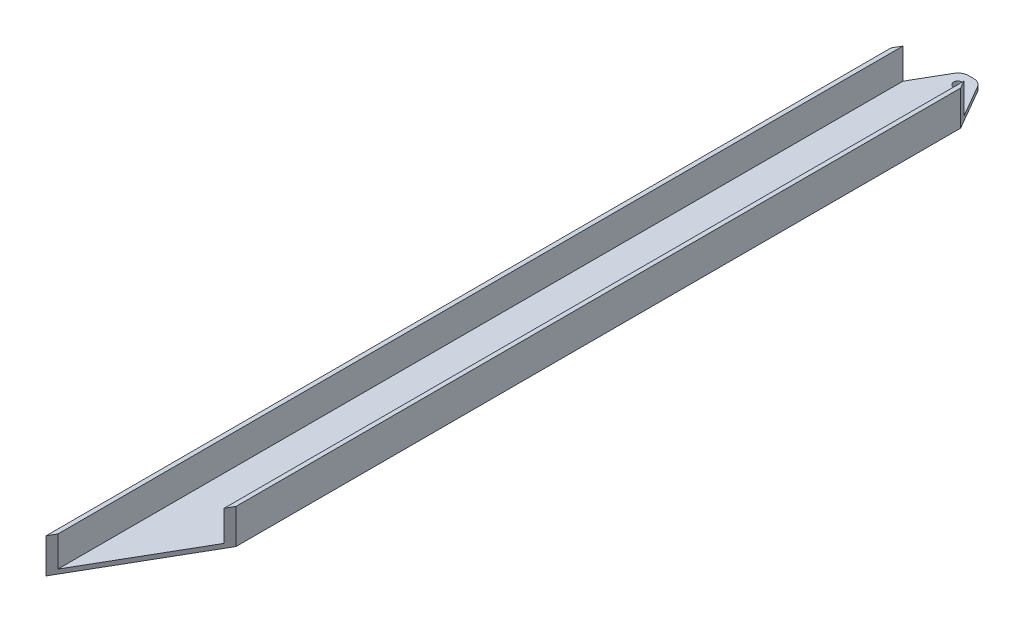
ISO-10303-21;
HEADER;
FILE_DESCRIPTION(('STEP AP214'),'2;1');
FILE_NAME('part.step','',(''),(''),'','','');
FILE_SCHEMA(('AUTOMOTIVE_DESIGN { 1 0 10303 214 1 1 1 1 }'));
ENDSEC;
DATA;
#1=APPLICATION_CONTEXT('core data for automotive mechanical design processes');
#2=APPLICATION_PROTOCOL_DEFINITION('international standard','automotive_design',2000,#1);
#3=PRODUCT_CONTEXT('',#1,'mechanical');
#4=PRODUCT('Part','Part','',(#3));
#5=PRODUCT_RELATED_PRODUCT_CATEGORY('part','',(#4));
#6=PRODUCT_DEFINITION_FORMATION('','',#4);
#7=PRODUCT_DEFINITION_CONTEXT('part definition',#1,'design');
#8=PRODUCT_DEFINITION('design','',#6,#7);
#9=PRODUCT_DEFINITION_SHAPE('','',#8);
#10=(LENGTH_UNIT() NAMED_UNIT(*) SI_UNIT(.MILLI.,.METRE.));
#11=(NAMED_UNIT(*) PLANE_ANGLE_UNIT() SI_UNIT($,.RADIAN.));
#12=(NAMED_UNIT(*) SI_UNIT($,.STERADIAN.) SOLID_ANGLE_UNIT());
#13=UNCERTAINTY_MEASURE_WITH_UNIT(LENGTH_MEASURE(1.E-05),#10,'distance_accuracy_value','');
#14=(GEOMETRIC_REPRESENTATION_CONTEXT(3) GLOBAL_UNCERTAINTY_ASSIGNED_CONTEXT((#13)) GLOBAL_UNIT_ASSIGNED_CONTEXT((#10,
#11,#12)) REPRESENTATION_CONTEXT('',''));
#15=CARTESIAN_POINT('',(0.,0.,0.));
#16=DIRECTION('',(0.,0.,1.));
#17=DIRECTION('',(1.,0.,0.));
#18=AXIS2_PLACEMENT_3D('',#15,#16,#17);
#19=CARTESIAN_POINT('',(-22.225,-9.525,650.24));
#20=DIRECTION('',(0.,-1.,0.));
#21=DIRECTION('',(0.,0.,-1.));
#22=AXIS2_PLACEMENT_3D('',#19,#20,#21);
#23=PLANE('',#22);
#24=CARTESIAN_POINT('',(0.,-9.525,9.52500000000001));
#25=DIRECTION('',(0.,-1.,0.));
#26=DIRECTION('',(0.,0.,-1.));
#27=AXIS2_PLACEMENT_3D('',#24,#25,#26);
#28=CIRCLE('',#27,3.175);
#29=CARTESIAN_POINT('',(0.,-9.525,12.7));
#30=VERTEX_POINT('',#29);
#31=EDGE_CURVE('E230',#30,#30,#28,.T.);
#32=ORIENTED_EDGE('',*,*,#31,.T.);
#33=EDGE_LOOP('',(#32));
#34=FACE_BOUND('',#33,.T.);
#35=DIRECTION('',(-1.,0.,0.));
#36=VECTOR('',#35,1.);
#37=CARTESIAN_POINT('',(-22.225,-9.525,0.));
#38=LINE('',#37,#36);
#39=CARTESIAN_POINT('',(1.95059094877508,-9.525,0.));
#40=VERTEX_POINT('',#39);
#41=CARTESIAN_POINT('',(-1.95059094877508,-9.525,0.));
#42=VERTEX_POINT('',#41);
#43=EDGE_CURVE('E207',#40,#42,#38,.T.);
#44=ORIENTED_EDGE('',*,*,#43,.T.);
#45=CARTESIAN_POINT('',(-1.95059094877508,-9.525,7.62));
#46=DIRECTION('',(0.,-1.,0.));
#47=DIRECTION('',(0.,0.,-1.));
#48=AXIS2_PLACEMENT_3D('',#45,#46,#47);
#49=CIRCLE('',#48,7.62);
#50=CARTESIAN_POINT('',(-8.54970452561243,-9.525,3.80999999999981));
#51=VERTEX_POINT('',#50);
#52=EDGE_CURVE('E189',#42,#51,#49,.F.);
#53=ORIENTED_EDGE('',*,*,#52,.T.);
#54=DIRECTION('',(-0.500000000000005,0.,0.866025403784436));
#55=VECTOR('',#54,1.);
#56=CARTESIAN_POINT('',(-291.880929278399,-9.525,494.554076642536));
#57=LINE('',#56,#55);
#58=CARTESIAN_POINT('',(-22.225,-9.525,27.4963065701556));
#59=VERTEX_POINT('',#58);
#60=EDGE_CURVE('E212',#51,#59,#57,.T.);
#61=ORIENTED_EDGE('',*,*,#60,.T.);
#62=DIRECTION('',(0.,0.,-1.));
#63=VECTOR('',#62,1.);
#64=CARTESIAN_POINT('',(-22.225,-9.525,650.24));
#65=LINE('',#64,#63);
#66=CARTESIAN_POINT('',(-22.225,-9.525,644.740738685969));
#67=VERTEX_POINT('',#66);
#68=EDGE_CURVE('E175',#67,#59,#65,.T.);
#69=ORIENTED_EDGE('',*,*,#68,.F.);
#70=DIRECTION('',(0.500000000000001,0.,-0.866025403784438));
#71=VECTOR('',#70,1.);
#72=CARTESIAN_POINT('',(-24.60625,-9.525,648.865184671492));
#73=LINE('',#72,#71);
#74=CARTESIAN_POINT('',(22.225,-9.525,567.751080289533));
#75=VERTEX_POINT('',#74);
#76=EDGE_CURVE('E245',#67,#75,#73,.T.);
#77=ORIENTED_EDGE('',*,*,#76,.T.);
#78=DIRECTION('',(0.,0.,-1.));
#79=VECTOR('',#78,1.);
#80=CARTESIAN_POINT('',(22.225,-9.525,650.24));
#81=LINE('',#80,#79);
#82=CARTESIAN_POINT('',(22.225,-9.525,27.4963065701556));
#83=VERTEX_POINT('',#82);
#84=EDGE_CURVE('E252',#75,#83,#81,.T.);
#85=ORIENTED_EDGE('',*,*,#84,.T.);
#86=DIRECTION('',(-0.500000000000005,0.,-0.866025403784436));
#87=VECTOR('',#86,1.);
#88=CARTESIAN_POINT('',(280.768429278398,-9.525,475.306662043427));
#89=LINE('',#88,#87);
#90=CARTESIAN_POINT('',(8.54970452561238,-9.525,3.80999999999981));
#91=VERTEX_POINT('',#90);
#92=EDGE_CURVE('E219',#83,#91,#89,.T.);
#93=ORIENTED_EDGE('',*,*,#92,.T.);
#94=CARTESIAN_POINT('',(1.95059094877508,-9.525,7.62));
#95=DIRECTION('',(0.,-1.,0.));
#96=DIRECTION('',(0.,0.,-1.));
#97=AXIS2_PLACEMENT_3D('',#94,#95,#96);
#98=CIRCLE('',#97,7.62);
#99=EDGE_CURVE('E186',#91,#40,#98,.F.);
#100=ORIENTED_EDGE('',*,*,#99,.T.);
#101=EDGE_LOOP('',(#44,#53,#61,#69,#77,#85,#93,#100));
#102=FACE_BOUND('',#101,.T.);
#103=ADVANCED_FACE('F36',(#34,#102),#23,.F.);
#104=CARTESIAN_POINT('',(-22.225,-9.525,650.24));
#105=DIRECTION('',(-1.,0.,0.));
#106=DIRECTION('',(0.,0.,1.));
#107=AXIS2_PLACEMENT_3D('',#104,#105,#106);
#108=PLANE('',#107);
#109=ORIENTED_EDGE('',*,*,#68,.T.);
#110=DIRECTION('',(0.,1.,0.));
#111=VECTOR('',#110,1.);
#112=CARTESIAN_POINT('',(-22.225,-9.525,27.4963065701556));
#113=LINE('',#112,#111);
#114=CARTESIAN_POINT('',(-22.225,12.7,27.4963065701556));
#115=VERTEX_POINT('',#114);
#116=EDGE_CURVE('E215',#59,#115,#113,.T.);
#117=ORIENTED_EDGE('',*,*,#116,.T.);
#118=DIRECTION('',(0.,0.,-1.));
#119=VECTOR('',#118,1.);
#120=CARTESIAN_POINT('',(-22.225,12.7,650.24));
#121=LINE('',#120,#119);
#122=CARTESIAN_POINT('',(-22.225,12.7,644.740738685969));
#123=VERTEX_POINT('',#122);
#124=EDGE_CURVE('E166',#123,#115,#121,.T.);
#125=ORIENTED_EDGE('',*,*,#124,.F.);
#126=DIRECTION('',(0.,-1.,0.));
#127=VECTOR('',#126,1.);
#128=CARTESIAN_POINT('',(-22.225,-9.525,644.740738685969));
#129=LINE('',#128,#127);
#130=EDGE_CURVE('E248',#123,#67,#129,.T.);
#131=ORIENTED_EDGE('',*,*,#130,.T.);
#132=EDGE_LOOP('',(#109,#117,#125,#131));
#133=FACE_BOUND('',#132,.T.);
#134=ADVANCED_FACE('F286',(#133),#108,.F.);
#135=CARTESIAN_POINT('',(-25.4,12.7,650.24));
#136=DIRECTION('',(0.,-1.,0.));
#137=DIRECTION('',(0.,0.,-1.));
#138=AXIS2_PLACEMENT_3D('',#135,#136,#137);
#139=PLANE('',#138);
#140=ORIENTED_EDGE('',*,*,#124,.T.);
#141=DIRECTION('',(0.500000000000005,0.,-0.866025403784436));
#142=VECTOR('',#141,1.);
#143=CARTESIAN_POINT('',(-6.35,12.7,0.));
#144=LINE('',#143,#142);
#145=CARTESIAN_POINT('',(-25.4,12.7,32.9955678841867));
#146=VERTEX_POINT('',#145);
#147=EDGE_CURVE('E274',#146,#115,#144,.T.);
#148=ORIENTED_EDGE('',*,*,#147,.F.);
#149=DIRECTION('',(0.,0.,-1.));
#150=VECTOR('',#149,1.);
#151=CARTESIAN_POINT('',(-25.4,12.7,650.24));
#152=LINE('',#151,#150);
#153=CARTESIAN_POINT('',(-25.4,12.7,650.24));
#154=VERTEX_POINT('',#153);
#155=EDGE_CURVE('E152',#154,#146,#152,.T.);
#156=ORIENTED_EDGE('',*,*,#155,.F.);
#157=DIRECTION('',(0.500000000000001,0.,-0.866025403784438));
#158=VECTOR('',#157,1.);
#159=CARTESIAN_POINT('',(-25.4,12.7,650.24));
#160=LINE('',#159,#158);
#161=EDGE_CURVE('E234',#154,#123,#160,.T.);
#162=ORIENTED_EDGE('',*,*,#161,.T.);
#163=EDGE_LOOP('',(#140,#148,#156,#162));
#164=FACE_BOUND('',#163,.T.);
#165=ADVANCED_FACE('F289',(#164),#139,.F.);
#166=CARTESIAN_POINT('',(-25.4,-12.7,650.24));
#167=DIRECTION('',(1.,0.,0.));
#168=DIRECTION('',(0.,0.,-1.));
#169=AXIS2_PLACEMENT_3D('',#166,#167,#168);
#170=PLANE('',#169);
#171=ORIENTED_EDGE('',*,*,#155,.T.);
#172=DIRECTION('',(0.,1.,0.));
#173=VECTOR('',#172,1.);
#174=CARTESIAN_POINT('',(-25.4,-12.7,32.9955678841867));
#175=LINE('',#174,#173);
#176=CARTESIAN_POINT('',(-25.4,-12.7,32.9955678841867));
#177=VERTEX_POINT('',#176);
#178=EDGE_CURVE('E137',#177,#146,#175,.T.);
#179=ORIENTED_EDGE('',*,*,#178,.F.);
#180=DIRECTION('',(0.,0.,-1.));
#181=VECTOR('',#180,1.);
#182=CARTESIAN_POINT('',(-25.4,-12.7,650.24));
#183=LINE('',#182,#181);
#184=CARTESIAN_POINT('',(-25.4,-12.7,650.24));
#185=VERTEX_POINT('',#184);
#186=EDGE_CURVE('E150',#185,#177,#183,.T.);
#187=ORIENTED_EDGE('',*,*,#186,.F.);
#188=DIRECTION('',(0.,-1.,0.));
#189=VECTOR('',#188,1.);
#190=CARTESIAN_POINT('',(-25.4,-12.7,650.24));
#191=LINE('',#190,#189);
#192=EDGE_CURVE('E206',#154,#185,#191,.T.);
#193=ORIENTED_EDGE('',*,*,#192,.F.);
#194=EDGE_LOOP('',(#171,#179,#187,#193));
#195=FACE_BOUND('',#194,.T.);
#196=ADVANCED_FACE('F148',(#195),#170,.F.);
#197=CARTESIAN_POINT('',(-25.4,-12.7,650.24));
#198=DIRECTION('',(0.,1.,0.));
#199=DIRECTION('',(-1.,0.,0.));
#200=AXIS2_PLACEMENT_3D('',#197,#198,#199);
#201=PLANE('',#200);
#202=CARTESIAN_POINT('',(0.,-12.7,9.52500000000001));
#203=DIRECTION('',(0.,1.,0.));
#204=DIRECTION('',(0.,0.,1.));
#205=AXIS2_PLACEMENT_3D('',#202,#203,#204);
#206=CIRCLE('',#205,3.175);
#207=CARTESIAN_POINT('',(0.,-12.7,12.7));
#208=VERTEX_POINT('',#207);
#209=EDGE_CURVE('E226',#208,#208,#206,.T.);
#210=ORIENTED_EDGE('',*,*,#209,.T.);
#211=EDGE_LOOP('',(#210));
#212=FACE_BOUND('',#211,.T.);
#213=DIRECTION('',(0.500000000000005,0.,-0.866025403784436));
#214=VECTOR('',#213,1.);
#215=CARTESIAN_POINT('',(-6.35,-12.7,0.));
#216=LINE('',#215,#214);
#217=CARTESIAN_POINT('',(-8.54970452561248,-12.7,3.80999999999996));
#218=VERTEX_POINT('',#217);
#219=EDGE_CURVE('E134',#177,#218,#216,.T.);
#220=ORIENTED_EDGE('',*,*,#219,.T.);
#221=CARTESIAN_POINT('',(-1.95059094877508,-12.7,7.62));
#222=DIRECTION('',(0.,1.,0.));
#223=DIRECTION('',(-1.,0.,0.));
#224=AXIS2_PLACEMENT_3D('',#221,#222,#223);
#225=CIRCLE('',#224,7.62);
#226=CARTESIAN_POINT('',(-1.95059094877508,-12.7,0.));
#227=VERTEX_POINT('',#226);
#228=EDGE_CURVE('E44',#218,#227,#225,.F.);
#229=ORIENTED_EDGE('',*,*,#228,.T.);
#230=DIRECTION('',(1.,0.,0.));
#231=VECTOR('',#230,1.);
#232=CARTESIAN_POINT('',(-25.4,-12.7,0.));
#233=LINE('',#232,#231);
#234=CARTESIAN_POINT('',(1.95059094877508,-12.7,0.));
#235=VERTEX_POINT('',#234);
#236=EDGE_CURVE('E197',#227,#235,#233,.T.);
#237=ORIENTED_EDGE('',*,*,#236,.T.);
#238=CARTESIAN_POINT('',(1.95059094877508,-12.7,7.62));
#239=DIRECTION('',(0.,1.,0.));
#240=DIRECTION('',(-1.,0.,0.));
#241=AXIS2_PLACEMENT_3D('',#238,#239,#240);
#242=CIRCLE('',#241,7.62);
#243=CARTESIAN_POINT('',(8.54970452561248,-12.7,3.80999999999996));
#244=VERTEX_POINT('',#243);
#245=EDGE_CURVE('E51',#235,#244,#242,.F.);
#246=ORIENTED_EDGE('',*,*,#245,.T.);
#247=DIRECTION('',(0.500000000000005,0.,0.866025403784436));
#248=VECTOR('',#247,1.);
#249=CARTESIAN_POINT('',(6.35,-12.7,0.));
#250=LINE('',#249,#248);
#251=CARTESIAN_POINT('',(25.4,-12.7,32.9955678841867));
#252=VERTEX_POINT('',#251);
#253=EDGE_CURVE('E142',#244,#252,#250,.T.);
#254=ORIENTED_EDGE('',*,*,#253,.T.);
#255=DIRECTION('',(0.,0.,-1.));
#256=VECTOR('',#255,1.);
#257=CARTESIAN_POINT('',(25.4,-12.7,650.24));
#258=LINE('',#257,#256);
#259=CARTESIAN_POINT('',(25.4,-12.7,562.251818975501));
#260=VERTEX_POINT('',#259);
#261=EDGE_CURVE('E161',#260,#252,#258,.T.);
#262=ORIENTED_EDGE('',*,*,#261,.F.);
#263=DIRECTION('',(0.500000000000001,0.,-0.866025403784438));
#264=VECTOR('',#263,1.);
#265=CARTESIAN_POINT('',(-25.4,-12.7,650.24));
#266=LINE('',#265,#264);
#267=EDGE_CURVE('E159',#185,#260,#266,.T.);
#268=ORIENTED_EDGE('',*,*,#267,.F.);
#269=ORIENTED_EDGE('',*,*,#186,.T.);
#270=EDGE_LOOP('',(#220,#229,#237,#246,#254,#262,#268,#269));
#271=FACE_BOUND('',#270,.T.);
#272=ADVANCED_FACE('F157',(#212,#271),#201,.F.);
#273=CARTESIAN_POINT('',(25.4,-12.7,650.24));
#274=DIRECTION('',(-1.,0.,0.));
#275=DIRECTION('',(0.,-1.,0.));
#276=AXIS2_PLACEMENT_3D('',#273,#274,#275);
#277=PLANE('',#276);
#278=ORIENTED_EDGE('',*,*,#261,.T.);
#279=DIRECTION('',(0.,1.,0.));
#280=VECTOR('',#279,1.);
#281=CARTESIAN_POINT('',(25.4,-12.7,32.9955678841867));
#282=LINE('',#281,#280);
#283=CARTESIAN_POINT('',(25.4,12.7,32.9955678841867));
#284=VERTEX_POINT('',#283);
#285=EDGE_CURVE('E154',#252,#284,#282,.T.);
#286=ORIENTED_EDGE('',*,*,#285,.T.);
#287=DIRECTION('',(0.,0.,-1.));
#288=VECTOR('',#287,1.);
#289=CARTESIAN_POINT('',(25.4,12.7,650.24));
#290=LINE('',#289,#288);
#291=CARTESIAN_POINT('',(25.4,12.7,562.251818975501));
#292=VERTEX_POINT('',#291);
#293=EDGE_CURVE('E169',#292,#284,#290,.T.);
#294=ORIENTED_EDGE('',*,*,#293,.F.);
#295=DIRECTION('',(0.,-1.,0.));
#296=VECTOR('',#295,1.);
#297=CARTESIAN_POINT('',(25.4,12.7,562.251818975501));
#298=LINE('',#297,#296);
#299=EDGE_CURVE('E237',#292,#260,#298,.T.);
#300=ORIENTED_EDGE('',*,*,#299,.T.);
#301=EDGE_LOOP('',(#278,#286,#294,#300));
#302=FACE_BOUND('',#301,.T.);
#303=ADVANCED_FACE('F268',(#302),#277,.F.);
#304=CARTESIAN_POINT('',(25.4,12.7,650.24));
#305=DIRECTION('',(0.,-1.,0.));
#306=DIRECTION('',(0.,0.,-1.));
#307=AXIS2_PLACEMENT_3D('',#304,#305,#306);
#308=PLANE('',#307);
#309=ORIENTED_EDGE('',*,*,#293,.T.);
#310=DIRECTION('',(0.500000000000005,0.,0.866025403784436));
#311=VECTOR('',#310,1.);
#312=CARTESIAN_POINT('',(6.35,12.7,0.));
#313=LINE('',#312,#311);
#314=CARTESIAN_POINT('',(22.225,12.7,27.4963065701554));
#315=VERTEX_POINT('',#314);
#316=EDGE_CURVE('E143',#315,#284,#313,.T.);
#317=ORIENTED_EDGE('',*,*,#316,.F.);
#318=DIRECTION('',(0.,0.,-1.));
#319=VECTOR('',#318,1.);
#320=CARTESIAN_POINT('',(22.225,12.7,650.24));
#321=LINE('',#320,#319);
#322=CARTESIAN_POINT('',(22.225,12.7,567.751080289533));
#323=VERTEX_POINT('',#322);
#324=EDGE_CURVE('E257',#323,#315,#321,.T.);
#325=ORIENTED_EDGE('',*,*,#324,.F.);
#326=EDGE_CURVE('E238',#323,#292,#160,.T.);
#327=ORIENTED_EDGE('',*,*,#326,.T.);
#328=EDGE_LOOP('',(#309,#317,#325,#327));
#329=FACE_BOUND('',#328,.T.);
#330=ADVANCED_FACE('F264',(#329),#308,.F.);
#331=CARTESIAN_POINT('',(22.225,-9.525,650.24));
#332=DIRECTION('',(1.,0.,0.));
#333=DIRECTION('',(0.,0.,-1.));
#334=AXIS2_PLACEMENT_3D('',#331,#332,#333);
#335=PLANE('',#334);
#336=ORIENTED_EDGE('',*,*,#324,.T.);
#337=DIRECTION('',(0.,-1.,0.));
#338=VECTOR('',#337,1.);
#339=CARTESIAN_POINT('',(22.225,-9.525,27.4963065701556));
#340=LINE('',#339,#338);
#341=EDGE_CURVE('E216',#315,#83,#340,.T.);
#342=ORIENTED_EDGE('',*,*,#341,.T.);
#343=ORIENTED_EDGE('',*,*,#84,.F.);
#344=DIRECTION('',(0.,1.,0.));
#345=VECTOR('',#344,1.);
#346=CARTESIAN_POINT('',(22.225,-9.52499999999999,567.751080289533));
#347=LINE('',#346,#345);
#348=EDGE_CURVE('E242',#75,#323,#347,.T.);
#349=ORIENTED_EDGE('',*,*,#348,.T.);
#350=EDGE_LOOP('',(#336,#342,#343,#349));
#351=FACE_BOUND('',#350,.T.);
#352=ADVANCED_FACE('F282',(#351),#335,.F.);
#353=CARTESIAN_POINT('',(0.,0.,0.));
#354=DIRECTION('',(0.,0.,1.));
#355=DIRECTION('',(1.,0.,0.));
#356=AXIS2_PLACEMENT_3D('',#353,#354,#355);
#357=PLANE('',#356);
#358=ORIENTED_EDGE('',*,*,#236,.F.);
#359=DIRECTION('',(0.,1.,0.));
#360=VECTOR('',#359,1.);
#361=CARTESIAN_POINT('',(-1.95059094877508,0.,0.));
#362=LINE('',#361,#360);
#363=EDGE_CURVE('E182',#227,#42,#362,.T.);
#364=ORIENTED_EDGE('',*,*,#363,.T.);
#365=ORIENTED_EDGE('',*,*,#43,.F.);
#366=DIRECTION('',(0.,1.,0.));
#367=VECTOR('',#366,1.);
#368=CARTESIAN_POINT('',(1.95059094877508,0.,0.));
#369=LINE('',#368,#367);
#370=EDGE_CURVE('E179',#40,#235,#369,.F.);
#371=ORIENTED_EDGE('',*,*,#370,.T.);
#372=EDGE_LOOP('',(#358,#364,#365,#371));
#373=FACE_BOUND('',#372,.T.);
#374=ADVANCED_FACE('F201',(#373),#357,.F.);
#375=CARTESIAN_POINT('',(-25.4,12.7,650.24));
#376=DIRECTION('',(-0.866025403784438,0.,-0.500000000000001));
#377=DIRECTION('',(-0.500000000000001,0.,0.866025403784438));
#378=AXIS2_PLACEMENT_3D('',#375,#376,#377);
#379=PLANE('',#378);
#380=ORIENTED_EDGE('',*,*,#161,.F.);
#381=ORIENTED_EDGE('',*,*,#192,.T.);
#382=ORIENTED_EDGE('',*,*,#267,.T.);
#383=ORIENTED_EDGE('',*,*,#299,.F.);
#384=ORIENTED_EDGE('',*,*,#326,.F.);
#385=ORIENTED_EDGE('',*,*,#348,.F.);
#386=ORIENTED_EDGE('',*,*,#76,.F.);
#387=ORIENTED_EDGE('',*,*,#130,.F.);
#388=EDGE_LOOP('',(#380,#381,#382,#383,#384,#385,#386,#387));
#389=FACE_BOUND('',#388,.T.);
#390=ADVANCED_FACE('F284',(#389),#379,.F.);
#391=CARTESIAN_POINT('',(0.,-12.7,9.52500000000001));
#392=DIRECTION('',(0.,1.,0.));
#393=DIRECTION('',(0.,0.,1.));
#394=AXIS2_PLACEMENT_3D('',#391,#392,#393);
#395=CYLINDRICAL_SURFACE('',#394,3.175);
#396=CARTESIAN_POINT('',(0.,-12.7,12.7));
#397=CARTESIAN_POINT('',(0.,-12.6669270833333,12.7));
#398=CARTESIAN_POINT('',(0.,-12.6338541666667,12.7));
#399=CARTESIAN_POINT('',(0.,-12.5677083333333,12.7));
#400=CARTESIAN_POINT('',(0.,-12.5346354166667,12.7));
#401=CARTESIAN_POINT('',(0.,-12.4684895833333,12.7));
#402=CARTESIAN_POINT('',(0.,-12.4354166666667,12.7));
#403=CARTESIAN_POINT('',(0.,-12.3692708333333,12.7));
#404=CARTESIAN_POINT('',(0.,-12.3361979166667,12.7));
#405=CARTESIAN_POINT('',(0.,-12.2700520833333,12.7));
#406=CARTESIAN_POINT('',(0.,-12.2369791666667,12.7));
#407=CARTESIAN_POINT('',(0.,-12.1708333333333,12.7));
#408=CARTESIAN_POINT('',(0.,-12.1377604166667,12.7));
#409=CARTESIAN_POINT('',(0.,-12.0716145833333,12.7));
#410=CARTESIAN_POINT('',(0.,-12.0385416666667,12.7));
#411=CARTESIAN_POINT('',(0.,-11.9723958333333,12.7));
#412=CARTESIAN_POINT('',(0.,-11.9393229166667,12.7));
#413=CARTESIAN_POINT('',(0.,-11.8731770833333,12.7));
#414=CARTESIAN_POINT('',(0.,-11.8401041666667,12.7));
#415=CARTESIAN_POINT('',(0.,-11.7739583333333,12.7));
#416=CARTESIAN_POINT('',(0.,-11.7408854166667,12.7));
#417=CARTESIAN_POINT('',(0.,-11.6747395833333,12.7));
#418=CARTESIAN_POINT('',(0.,-11.6416666666667,12.7));
#419=CARTESIAN_POINT('',(0.,-11.5755208333333,12.7));
#420=CARTESIAN_POINT('',(0.,-11.5424479166667,12.7));
#421=CARTESIAN_POINT('',(0.,-11.4763020833333,12.7));
#422=CARTESIAN_POINT('',(0.,-11.4432291666667,12.7));
#423=CARTESIAN_POINT('',(0.,-11.3770833333333,12.7));
#424=CARTESIAN_POINT('',(0.,-11.3440104166667,12.7));
#425=CARTESIAN_POINT('',(0.,-11.2778645833333,12.7));
#426=CARTESIAN_POINT('',(0.,-11.2447916666667,12.7));
#427=CARTESIAN_POINT('',(0.,-11.1786458333333,12.7));
#428=CARTESIAN_POINT('',(0.,-11.1455729166667,12.7));
#429=CARTESIAN_POINT('',(0.,-11.0794270833333,12.7));
#430=CARTESIAN_POINT('',(0.,-11.0463541666667,12.7));
#431=CARTESIAN_POINT('',(0.,-10.9802083333333,12.7));
#432=CARTESIAN_POINT('',(0.,-10.9471354166667,12.7));
#433=CARTESIAN_POINT('',(0.,-10.8809895833333,12.7));
#434=CARTESIAN_POINT('',(0.,-10.8479166666667,12.7));
#435=CARTESIAN_POINT('',(0.,-10.7817708333333,12.7));
#436=CARTESIAN_POINT('',(0.,-10.7486979166667,12.7));
#437=CARTESIAN_POINT('',(0.,-10.6825520833333,12.7));
#438=CARTESIAN_POINT('',(0.,-10.6494791666667,12.7));
#439=CARTESIAN_POINT('',(0.,-10.5833333333333,12.7));
#440=CARTESIAN_POINT('',(0.,-10.5502604166667,12.7));
#441=CARTESIAN_POINT('',(0.,-10.4841145833333,12.7));
#442=CARTESIAN_POINT('',(0.,-10.4510416666667,12.7));
#443=CARTESIAN_POINT('',(0.,-10.3848958333333,12.7));
#444=CARTESIAN_POINT('',(0.,-10.3518229166667,12.7));
#445=CARTESIAN_POINT('',(0.,-10.2856770833333,12.7));
#446=CARTESIAN_POINT('',(0.,-10.2526041666667,12.7));
#447=CARTESIAN_POINT('',(0.,-10.1864583333333,12.7));
#448=CARTESIAN_POINT('',(0.,-10.1533854166667,12.7));
#449=CARTESIAN_POINT('',(0.,-10.0872395833333,12.7));
#450=CARTESIAN_POINT('',(0.,-10.0541666666667,12.7));
#451=CARTESIAN_POINT('',(0.,-9.98802083333333,12.7));
#452=CARTESIAN_POINT('',(0.,-9.95494791666667,12.7));
#453=CARTESIAN_POINT('',(0.,-9.88880208333333,12.7));
#454=CARTESIAN_POINT('',(0.,-9.85572916666666,12.7));
#455=CARTESIAN_POINT('',(0.,-9.78958333333333,12.7));
#456=CARTESIAN_POINT('',(0.,-9.75651041666666,12.7));
#457=CARTESIAN_POINT('',(0.,-9.69036458333333,12.7));
#458=CARTESIAN_POINT('',(0.,-9.65729166666666,12.7));
#459=CARTESIAN_POINT('',(0.,-9.59114583333333,12.7));
#460=CARTESIAN_POINT('',(0.,-9.55807291666666,12.7));
#461=CARTESIAN_POINT('',(0.,-9.525,12.7));
#462=B_SPLINE_CURVE_WITH_KNOTS('',3,(#396,#397,#398,#399,#400,#401,#402,#403,#404,#405,#406,
#407,#408,#409,#410,#411,#412,#413,#414,#415,#416,#417,#418,#419,#420,#421,#422,#423,#424,#425,
#426,#427,#428,#429,#430,#431,#432,#433,#434,#435,#436,#437,#438,#439,#440,#441,#442,#443,#444,
#445,#446,#447,#448,#449,#450,#451,#452,#453,#454,#455,#456,#457,#458,#459,#460,#461),
.UNSPECIFIED.,.F.,.F.,(4,2,2,2,2,2,2,2,2,2,2,2,2,2,2,2,2,2,2,2,2,2,2,2,2,2,2,2,2,2,2,2,4),(0.,
0.0992187499999995,0.198437499999999,0.29765625,0.396875,0.496093750000001,0.5953125,0.69453125,
0.793750000000001,0.892968750000001,0.992187500000002,1.09140625,1.190625,1.28984375,1.3890625,
1.48828125,1.5875,1.68671875,1.7859375,1.88515625,1.984375,2.08359375,2.1828125,2.28203125,
2.38125,2.48046875,2.5796875,2.67890625000001,2.778125,2.87734375,2.97656250000001,3.07578125,
3.17500000000001),.UNSPECIFIED.);
#463=EDGE_CURVE('BSEAM312',#208,#30,#462,.T.);
#464=ORIENTED_EDGE('',*,*,#209,.F.);
#465=ORIENTED_EDGE('',*,*,#31,.F.);
#466=ORIENTED_EDGE('',*,*,#463,.T.);
#467=ORIENTED_EDGE('',*,*,#463,.F.);
#468=EDGE_LOOP('',(#464,#466,#465,#467));
#469=FACE_BOUND('',#468,.T.);
#470=ADVANCED_FACE('F312',(#469),#395,.F.);
#471=CARTESIAN_POINT('',(-6.35,-12.7,0.));
#472=DIRECTION('',(0.866025403784436,0.,0.500000000000005));
#473=DIRECTION('',(0.500000000000005,0.,-0.866025403784436));
#474=AXIS2_PLACEMENT_3D('',#471,#472,#473);
#475=PLANE('',#474);
#476=ORIENTED_EDGE('',*,*,#60,.F.);
#477=DIRECTION('',(0.,1.,0.));
#478=VECTOR('',#477,1.);
#479=CARTESIAN_POINT('',(-8.54970452561248,-12.7,3.80999999999996));
#480=LINE('',#479,#478);
#481=EDGE_CURVE('E62',#51,#218,#480,.F.);
#482=ORIENTED_EDGE('',*,*,#481,.T.);
#483=ORIENTED_EDGE('',*,*,#219,.F.);
#484=ORIENTED_EDGE('',*,*,#178,.T.);
#485=ORIENTED_EDGE('',*,*,#147,.T.);
#486=ORIENTED_EDGE('',*,*,#116,.F.);
#487=EDGE_LOOP('',(#476,#482,#483,#484,#485,#486));
#488=FACE_BOUND('',#487,.T.);
#489=ADVANCED_FACE('F136',(#488),#475,.F.);
#490=CARTESIAN_POINT('',(6.35,-12.7,0.));
#491=DIRECTION('',(-0.866025403784436,0.,0.500000000000005));
#492=DIRECTION('',(0.500000000000005,0.,0.866025403784436));
#493=AXIS2_PLACEMENT_3D('',#490,#491,#492);
#494=PLANE('',#493);
#495=ORIENTED_EDGE('',*,*,#253,.F.);
#496=DIRECTION('',(0.,1.,0.));
#497=VECTOR('',#496,1.);
#498=CARTESIAN_POINT('',(8.54970452561248,-12.7,3.80999999999996));
#499=LINE('',#498,#497);
#500=EDGE_CURVE('E11',#244,#91,#499,.T.);
#501=ORIENTED_EDGE('',*,*,#500,.T.);
#502=ORIENTED_EDGE('',*,*,#92,.F.);
#503=ORIENTED_EDGE('',*,*,#341,.F.);
#504=ORIENTED_EDGE('',*,*,#316,.T.);
#505=ORIENTED_EDGE('',*,*,#285,.F.);
#506=EDGE_LOOP('',(#495,#501,#502,#503,#504,#505));
#507=FACE_BOUND('',#506,.T.);
#508=ADVANCED_FACE('F278',(#507),#494,.F.);
#509=CARTESIAN_POINT('',(-1.95059094877508,0.,7.62));
#510=DIRECTION('',(0.,1.,0.));
#511=DIRECTION('',(0.,0.,1.));
#512=AXIS2_PLACEMENT_3D('',#509,#510,#511);
#513=CYLINDRICAL_SURFACE('',#512,7.62);
#514=ORIENTED_EDGE('',*,*,#228,.F.);
#515=ORIENTED_EDGE('',*,*,#481,.F.);
#516=ORIENTED_EDGE('',*,*,#52,.F.);
#517=ORIENTED_EDGE('',*,*,#363,.F.);
#518=EDGE_LOOP('',(#514,#515,#516,#517));
#519=FACE_BOUND('',#518,.T.);
#520=ADVANCED_FACE('F209',(#519),#513,.T.);
#521=CARTESIAN_POINT('',(1.95059094877508,-12.7,7.62));
#522=DIRECTION('',(0.,1.,0.));
#523=DIRECTION('',(0.,0.,1.));
#524=AXIS2_PLACEMENT_3D('',#521,#522,#523);
#525=CYLINDRICAL_SURFACE('',#524,7.62);
#526=ORIENTED_EDGE('',*,*,#245,.F.);
#527=ORIENTED_EDGE('',*,*,#370,.F.);
#528=ORIENTED_EDGE('',*,*,#99,.F.);
#529=ORIENTED_EDGE('',*,*,#500,.F.);
#530=EDGE_LOOP('',(#526,#527,#528,#529));
#531=FACE_BOUND('',#530,.T.);
#532=ADVANCED_FACE('F38',(#531),#525,.T.);
#533=CLOSED_SHELL('',(#103,#134,#165,#196,#272,#303,#330,#352,#374,#390,#470,#489,#508,#520,#532));
#534=MANIFOLD_SOLID_BREP('B2',#533);
#535=ADVANCED_BREP_SHAPE_REPRESENTATION('',(#18,#534),#14);
#536=SHAPE_DEFINITION_REPRESENTATION(#9,#535);
ENDSEC;
END-ISO-10303-21;
